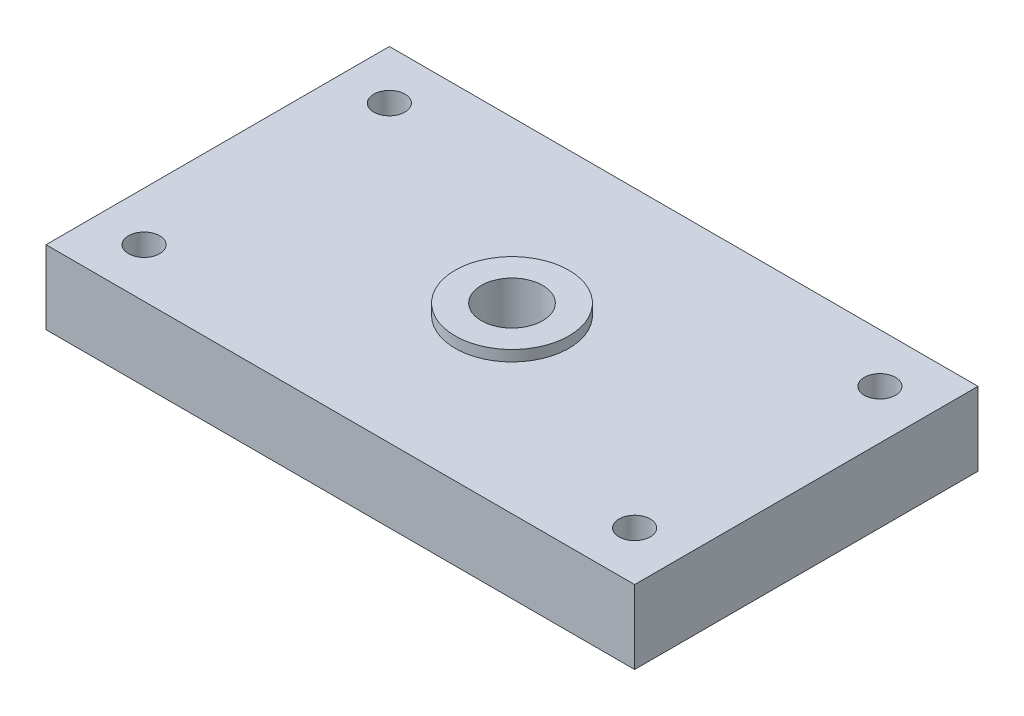
ISO-10303-21;
HEADER;
FILE_DESCRIPTION(('STEP AP214'),'2;1');
FILE_NAME('part.step','',(''),(''),'','','');
FILE_SCHEMA(('AUTOMOTIVE_DESIGN { 1 0 10303 214 1 1 1 1 }'));
ENDSEC;
DATA;
#1=APPLICATION_CONTEXT('core data for automotive mechanical design processes');
#2=APPLICATION_PROTOCOL_DEFINITION('international standard','automotive_design',2000,#1);
#3=PRODUCT_CONTEXT('',#1,'mechanical');
#4=PRODUCT('Part','Part','',(#3));
#5=PRODUCT_RELATED_PRODUCT_CATEGORY('part','',(#4));
#6=PRODUCT_DEFINITION_FORMATION('','',#4);
#7=PRODUCT_DEFINITION_CONTEXT('part definition',#1,'design');
#8=PRODUCT_DEFINITION('design','',#6,#7);
#9=PRODUCT_DEFINITION_SHAPE('','',#8);
#10=(LENGTH_UNIT() NAMED_UNIT(*) SI_UNIT(.MILLI.,.METRE.));
#11=(NAMED_UNIT(*) PLANE_ANGLE_UNIT() SI_UNIT($,.RADIAN.));
#12=(NAMED_UNIT(*) SI_UNIT($,.STERADIAN.) SOLID_ANGLE_UNIT());
#13=UNCERTAINTY_MEASURE_WITH_UNIT(LENGTH_MEASURE(1.E-05),#10,'distance_accuracy_value','');
#14=(GEOMETRIC_REPRESENTATION_CONTEXT(3) GLOBAL_UNCERTAINTY_ASSIGNED_CONTEXT((#13)) GLOBAL_UNIT_ASSIGNED_CONTEXT((#10,
#11,#12)) REPRESENTATION_CONTEXT('',''));
#15=CARTESIAN_POINT('',(0.,0.,0.));
#16=DIRECTION('',(0.,0.,1.));
#17=DIRECTION('',(1.,0.,0.));
#18=AXIS2_PLACEMENT_3D('',#15,#16,#17);
#19=CARTESIAN_POINT('',(0.,9.525,-44.45));
#20=DIRECTION('',(0.,-1.,0.));
#21=DIRECTION('',(0.,0.,-1.));
#22=AXIS2_PLACEMENT_3D('',#19,#20,#21);
#23=PLANE('',#22);
#24=DIRECTION('',(0.,0.,1.));
#25=VECTOR('',#24,1.);
#26=CARTESIAN_POINT('',(0.,9.525,0.));
#27=LINE('',#26,#25);
#28=CARTESIAN_POINT('',(0.,9.525,-44.45));
#29=VERTEX_POINT('',#28);
#30=CARTESIAN_POINT('',(0.,9.525,0.));
#31=VERTEX_POINT('',#30);
#32=EDGE_CURVE('E92',#29,#31,#27,.T.);
#33=ORIENTED_EDGE('',*,*,#32,.T.);
#34=DIRECTION('',(1.,0.,0.));
#35=VECTOR('',#34,1.);
#36=CARTESIAN_POINT('',(0.,9.525,0.));
#37=LINE('',#36,#35);
#38=CARTESIAN_POINT('',(76.2,9.525,0.));
#39=VERTEX_POINT('',#38);
#40=EDGE_CURVE('E87',#31,#39,#37,.T.);
#41=ORIENTED_EDGE('',*,*,#40,.T.);
#42=DIRECTION('',(0.,0.,-1.));
#43=VECTOR('',#42,1.);
#44=CARTESIAN_POINT('',(76.2,9.525,0.));
#45=LINE('',#44,#43);
#46=CARTESIAN_POINT('',(76.2,9.525,-44.45));
#47=VERTEX_POINT('',#46);
#48=EDGE_CURVE('E90',#39,#47,#45,.T.);
#49=ORIENTED_EDGE('',*,*,#48,.T.);
#50=DIRECTION('',(-1.,0.,0.));
#51=VECTOR('',#50,1.);
#52=CARTESIAN_POINT('',(0.,9.525,-44.45));
#53=LINE('',#52,#51);
#54=EDGE_CURVE('E56',#47,#29,#53,.T.);
#55=ORIENTED_EDGE('',*,*,#54,.T.);
#56=EDGE_LOOP('',(#33,#41,#49,#55));
#57=FACE_BOUND('',#56,.T.);
#58=CARTESIAN_POINT('',(6.35,9.525,-6.34999999999999));
#59=DIRECTION('',(0.,1.,0.));
#60=DIRECTION('',(0.,0.,1.));
#61=AXIS2_PLACEMENT_3D('',#58,#59,#60);
#62=CIRCLE('',#61,2.01929999999999);
#63=CARTESIAN_POINT('',(6.35,9.525,-4.3307));
#64=VERTEX_POINT('',#63);
#65=EDGE_CURVE('E193',#64,#64,#62,.T.);
#66=ORIENTED_EDGE('',*,*,#65,.F.);
#67=EDGE_LOOP('',(#66));
#68=FACE_BOUND('',#67,.T.);
#69=CARTESIAN_POINT('',(69.85,9.525,-6.34999999999999));
#70=DIRECTION('',(0.,1.,0.));
#71=DIRECTION('',(0.,0.,1.));
#72=AXIS2_PLACEMENT_3D('',#69,#70,#71);
#73=CIRCLE('',#72,2.01929999999999);
#74=CARTESIAN_POINT('',(69.85,9.525,-4.3307));
#75=VERTEX_POINT('',#74);
#76=EDGE_CURVE('E187',#75,#75,#73,.T.);
#77=ORIENTED_EDGE('',*,*,#76,.F.);
#78=EDGE_LOOP('',(#77));
#79=FACE_BOUND('',#78,.T.);
#80=CARTESIAN_POINT('',(69.85,9.525,-38.1));
#81=DIRECTION('',(0.,1.,0.));
#82=DIRECTION('',(0.,0.,1.));
#83=AXIS2_PLACEMENT_3D('',#80,#81,#82);
#84=CIRCLE('',#83,2.01929999999999);
#85=CARTESIAN_POINT('',(69.85,9.525,-36.0807));
#86=VERTEX_POINT('',#85);
#87=EDGE_CURVE('E181',#86,#86,#84,.T.);
#88=ORIENTED_EDGE('',*,*,#87,.F.);
#89=EDGE_LOOP('',(#88));
#90=FACE_BOUND('',#89,.T.);
#91=CARTESIAN_POINT('',(6.35,9.525,-38.1));
#92=DIRECTION('',(0.,1.,0.));
#93=DIRECTION('',(0.,0.,1.));
#94=AXIS2_PLACEMENT_3D('',#91,#92,#93);
#95=CIRCLE('',#94,2.01929999999999);
#96=CARTESIAN_POINT('',(6.35,9.525,-36.0807));
#97=VERTEX_POINT('',#96);
#98=EDGE_CURVE('E172',#97,#97,#95,.T.);
#99=ORIENTED_EDGE('',*,*,#98,.F.);
#100=EDGE_LOOP('',(#99));
#101=FACE_BOUND('',#100,.T.);
#102=CARTESIAN_POINT('',(38.1,9.525,-22.225));
#103=DIRECTION('',(0.,-1.,0.));
#104=DIRECTION('',(0.,0.,-1.));
#105=AXIS2_PLACEMENT_3D('',#102,#103,#104);
#106=CIRCLE('',#105,7.366);
#107=CARTESIAN_POINT('',(38.1,9.525,-29.591));
#108=VERTEX_POINT('',#107);
#109=EDGE_CURVE('E11',#108,#108,#106,.F.);
#110=ORIENTED_EDGE('',*,*,#109,.F.);
#111=EDGE_LOOP('',(#110));
#112=FACE_BOUND('',#111,.T.);
#113=ADVANCED_FACE('F39',(#57,#68,#79,#90,#101,#112),#23,.F.);
#114=CARTESIAN_POINT('',(0.,9.525,0.));
#115=DIRECTION('',(1.,0.,0.));
#116=DIRECTION('',(0.,0.,-1.));
#117=AXIS2_PLACEMENT_3D('',#114,#115,#116);
#118=PLANE('',#117);
#119=DIRECTION('',(0.,0.,1.));
#120=VECTOR('',#119,1.);
#121=CARTESIAN_POINT('',(0.,0.,0.));
#122=LINE('',#121,#120);
#123=CARTESIAN_POINT('',(0.,0.,-44.45));
#124=VERTEX_POINT('',#123);
#125=CARTESIAN_POINT('',(0.,0.,0.));
#126=VERTEX_POINT('',#125);
#127=EDGE_CURVE('E106',#124,#126,#122,.T.);
#128=ORIENTED_EDGE('',*,*,#127,.T.);
#129=DIRECTION('',(0.,-1.,0.));
#130=VECTOR('',#129,1.);
#131=CARTESIAN_POINT('',(0.,9.525,0.));
#132=LINE('',#131,#130);
#133=EDGE_CURVE('E48',#31,#126,#132,.T.);
#134=ORIENTED_EDGE('',*,*,#133,.F.);
#135=ORIENTED_EDGE('',*,*,#32,.F.);
#136=DIRECTION('',(0.,-1.,0.));
#137=VECTOR('',#136,1.);
#138=CARTESIAN_POINT('',(0.,9.525,-44.45));
#139=LINE('',#138,#137);
#140=EDGE_CURVE('E102',#29,#124,#139,.T.);
#141=ORIENTED_EDGE('',*,*,#140,.T.);
#142=EDGE_LOOP('',(#128,#134,#135,#141));
#143=FACE_BOUND('',#142,.T.);
#144=ADVANCED_FACE('F41',(#143),#118,.F.);
#145=CARTESIAN_POINT('',(0.,9.525,0.));
#146=DIRECTION('',(0.,0.,-1.));
#147=DIRECTION('',(-1.,0.,0.));
#148=AXIS2_PLACEMENT_3D('',#145,#146,#147);
#149=PLANE('',#148);
#150=DIRECTION('',(1.,0.,0.));
#151=VECTOR('',#150,1.);
#152=CARTESIAN_POINT('',(0.,0.,0.));
#153=LINE('',#152,#151);
#154=CARTESIAN_POINT('',(76.2,0.,0.));
#155=VERTEX_POINT('',#154);
#156=EDGE_CURVE('E97',#126,#155,#153,.T.);
#157=ORIENTED_EDGE('',*,*,#156,.T.);
#158=DIRECTION('',(0.,-1.,0.));
#159=VECTOR('',#158,1.);
#160=CARTESIAN_POINT('',(76.2,9.525,0.));
#161=LINE('',#160,#159);
#162=EDGE_CURVE('E95',#39,#155,#161,.T.);
#163=ORIENTED_EDGE('',*,*,#162,.F.);
#164=ORIENTED_EDGE('',*,*,#40,.F.);
#165=ORIENTED_EDGE('',*,*,#133,.T.);
#166=EDGE_LOOP('',(#157,#163,#164,#165));
#167=FACE_BOUND('',#166,.T.);
#168=ADVANCED_FACE('F96',(#167),#149,.F.);
#169=CARTESIAN_POINT('',(76.2,9.525,0.));
#170=DIRECTION('',(-1.,0.,0.));
#171=DIRECTION('',(0.,0.,1.));
#172=AXIS2_PLACEMENT_3D('',#169,#170,#171);
#173=PLANE('',#172);
#174=DIRECTION('',(0.,0.,-1.));
#175=VECTOR('',#174,1.);
#176=CARTESIAN_POINT('',(76.2,0.,0.));
#177=LINE('',#176,#175);
#178=CARTESIAN_POINT('',(76.2,0.,-44.45));
#179=VERTEX_POINT('',#178);
#180=EDGE_CURVE('E73',#155,#179,#177,.T.);
#181=ORIENTED_EDGE('',*,*,#180,.T.);
#182=DIRECTION('',(0.,-1.,0.));
#183=VECTOR('',#182,1.);
#184=CARTESIAN_POINT('',(76.2,9.525,-44.45));
#185=LINE('',#184,#183);
#186=EDGE_CURVE('E98',#47,#179,#185,.T.);
#187=ORIENTED_EDGE('',*,*,#186,.F.);
#188=ORIENTED_EDGE('',*,*,#48,.F.);
#189=ORIENTED_EDGE('',*,*,#162,.T.);
#190=EDGE_LOOP('',(#181,#187,#188,#189));
#191=FACE_BOUND('',#190,.T.);
#192=ADVANCED_FACE('F100',(#191),#173,.F.);
#193=CARTESIAN_POINT('',(0.,9.525,-44.45));
#194=DIRECTION('',(0.,0.,1.));
#195=DIRECTION('',(1.,0.,0.));
#196=AXIS2_PLACEMENT_3D('',#193,#194,#195);
#197=PLANE('',#196);
#198=DIRECTION('',(-1.,0.,0.));
#199=VECTOR('',#198,1.);
#200=CARTESIAN_POINT('',(0.,0.,-44.45));
#201=LINE('',#200,#199);
#202=EDGE_CURVE('E79',#179,#124,#201,.T.);
#203=ORIENTED_EDGE('',*,*,#202,.T.);
#204=ORIENTED_EDGE('',*,*,#140,.F.);
#205=ORIENTED_EDGE('',*,*,#54,.F.);
#206=ORIENTED_EDGE('',*,*,#186,.T.);
#207=EDGE_LOOP('',(#203,#204,#205,#206));
#208=FACE_BOUND('',#207,.T.);
#209=ADVANCED_FACE('F120',(#208),#197,.F.);
#210=CARTESIAN_POINT('',(0.,0.,-44.45));
#211=DIRECTION('',(0.,-1.,0.));
#212=DIRECTION('',(0.,0.,-1.));
#213=AXIS2_PLACEMENT_3D('',#210,#211,#212);
#214=PLANE('',#213);
#215=CARTESIAN_POINT('',(38.1,0.,-22.225));
#216=DIRECTION('',(0.,-1.,0.));
#217=DIRECTION('',(0.,0.,-1.));
#218=AXIS2_PLACEMENT_3D('',#215,#216,#217);
#219=CIRCLE('',#218,3.96874999999999);
#220=CARTESIAN_POINT('',(38.1,0.,-26.19375));
#221=VERTEX_POINT('',#220);
#222=EDGE_CURVE('E168',#221,#221,#219,.T.);
#223=ORIENTED_EDGE('',*,*,#222,.F.);
#224=EDGE_LOOP('',(#223));
#225=FACE_BOUND('',#224,.T.);
#226=CARTESIAN_POINT('',(6.35,0.,-38.1));
#227=DIRECTION('',(0.,1.,0.));
#228=DIRECTION('',(0.,0.,1.));
#229=AXIS2_PLACEMENT_3D('',#226,#227,#228);
#230=CIRCLE('',#229,2.0193);
#231=CARTESIAN_POINT('',(6.35,0.,-36.0807));
#232=VERTEX_POINT('',#231);
#233=EDGE_CURVE('E178',#232,#232,#230,.T.);
#234=ORIENTED_EDGE('',*,*,#233,.T.);
#235=EDGE_LOOP('',(#234));
#236=FACE_BOUND('',#235,.T.);
#237=CARTESIAN_POINT('',(69.85,0.,-38.1));
#238=DIRECTION('',(0.,1.,0.));
#239=DIRECTION('',(0.,0.,1.));
#240=AXIS2_PLACEMENT_3D('',#237,#238,#239);
#241=CIRCLE('',#240,2.0193);
#242=CARTESIAN_POINT('',(69.85,0.,-36.0807));
#243=VERTEX_POINT('',#242);
#244=EDGE_CURVE('E184',#243,#243,#241,.T.);
#245=ORIENTED_EDGE('',*,*,#244,.T.);
#246=EDGE_LOOP('',(#245));
#247=FACE_BOUND('',#246,.T.);
#248=CARTESIAN_POINT('',(69.85,0.,-6.34999999999999));
#249=DIRECTION('',(0.,1.,0.));
#250=DIRECTION('',(0.,0.,1.));
#251=AXIS2_PLACEMENT_3D('',#248,#249,#250);
#252=CIRCLE('',#251,2.0193);
#253=CARTESIAN_POINT('',(69.85,0.,-4.33069999999999));
#254=VERTEX_POINT('',#253);
#255=EDGE_CURVE('E190',#254,#254,#252,.T.);
#256=ORIENTED_EDGE('',*,*,#255,.T.);
#257=EDGE_LOOP('',(#256));
#258=FACE_BOUND('',#257,.T.);
#259=CARTESIAN_POINT('',(6.35,0.,-6.34999999999999));
#260=DIRECTION('',(0.,1.,0.));
#261=DIRECTION('',(0.,0.,1.));
#262=AXIS2_PLACEMENT_3D('',#259,#260,#261);
#263=CIRCLE('',#262,2.0193);
#264=CARTESIAN_POINT('',(6.35,0.,-4.33069999999999));
#265=VERTEX_POINT('',#264);
#266=EDGE_CURVE('E109',#265,#265,#263,.T.);
#267=ORIENTED_EDGE('',*,*,#266,.T.);
#268=EDGE_LOOP('',(#267));
#269=FACE_BOUND('',#268,.T.);
#270=ORIENTED_EDGE('',*,*,#127,.F.);
#271=ORIENTED_EDGE('',*,*,#202,.F.);
#272=ORIENTED_EDGE('',*,*,#180,.F.);
#273=ORIENTED_EDGE('',*,*,#156,.F.);
#274=EDGE_LOOP('',(#270,#271,#272,#273));
#275=FACE_BOUND('',#274,.T.);
#276=ADVANCED_FACE('F117',(#225,#236,#247,#258,#269,#275),#214,.T.);
#277=CARTESIAN_POINT('',(6.35,9.525,-6.34999999999999));
#278=DIRECTION('',(0.,1.,0.));
#279=DIRECTION('',(0.,0.,1.));
#280=AXIS2_PLACEMENT_3D('',#277,#278,#279);
#281=CYLINDRICAL_SURFACE('',#280,2.01929999999999);
#282=ORIENTED_EDGE('',*,*,#266,.F.);
#283=EDGE_LOOP('',(#282));
#284=FACE_BOUND('',#283,.T.);
#285=ORIENTED_EDGE('',*,*,#65,.T.);
#286=EDGE_LOOP('',(#285));
#287=FACE_BOUND('',#286,.T.);
#288=ADVANCED_FACE('F119',(#284,#287),#281,.F.);
#289=CARTESIAN_POINT('',(69.85,9.525,-6.34999999999999));
#290=DIRECTION('',(0.,1.,0.));
#291=DIRECTION('',(0.,0.,1.));
#292=AXIS2_PLACEMENT_3D('',#289,#290,#291);
#293=CYLINDRICAL_SURFACE('',#292,2.01929999999999);
#294=ORIENTED_EDGE('',*,*,#255,.F.);
#295=EDGE_LOOP('',(#294));
#296=FACE_BOUND('',#295,.T.);
#297=ORIENTED_EDGE('',*,*,#76,.T.);
#298=EDGE_LOOP('',(#297));
#299=FACE_BOUND('',#298,.T.);
#300=ADVANCED_FACE('F127',(#296,#299),#293,.F.);
#301=CARTESIAN_POINT('',(69.85,9.525,-38.1));
#302=DIRECTION('',(0.,1.,0.));
#303=DIRECTION('',(0.,0.,1.));
#304=AXIS2_PLACEMENT_3D('',#301,#302,#303);
#305=CYLINDRICAL_SURFACE('',#304,2.01929999999999);
#306=ORIENTED_EDGE('',*,*,#244,.F.);
#307=EDGE_LOOP('',(#306));
#308=FACE_BOUND('',#307,.T.);
#309=ORIENTED_EDGE('',*,*,#87,.T.);
#310=EDGE_LOOP('',(#309));
#311=FACE_BOUND('',#310,.T.);
#312=ADVANCED_FACE('F141',(#308,#311),#305,.F.);
#313=CARTESIAN_POINT('',(6.35,9.525,-38.1));
#314=DIRECTION('',(0.,1.,0.));
#315=DIRECTION('',(0.,0.,1.));
#316=AXIS2_PLACEMENT_3D('',#313,#314,#315);
#317=CYLINDRICAL_SURFACE('',#316,2.01929999999999);
#318=ORIENTED_EDGE('',*,*,#233,.F.);
#319=EDGE_LOOP('',(#318));
#320=FACE_BOUND('',#319,.T.);
#321=ORIENTED_EDGE('',*,*,#98,.T.);
#322=EDGE_LOOP('',(#321));
#323=FACE_BOUND('',#322,.T.);
#324=ADVANCED_FACE('F145',(#320,#323),#317,.F.);
#325=CARTESIAN_POINT('',(38.1,10.922,-22.225));
#326=DIRECTION('',(0.,-1.,0.));
#327=DIRECTION('',(0.,0.,-1.));
#328=AXIS2_PLACEMENT_3D('',#325,#326,#327);
#329=CYLINDRICAL_SURFACE('',#328,7.366);
#330=CARTESIAN_POINT('',(38.1,10.922,-22.225));
#331=DIRECTION('',(0.,1.,0.));
#332=DIRECTION('',(0.,0.,1.));
#333=AXIS2_PLACEMENT_3D('',#330,#331,#332);
#334=CIRCLE('',#333,7.366);
#335=CARTESIAN_POINT('',(38.1,10.922,-14.859));
#336=VERTEX_POINT('',#335);
#337=EDGE_CURVE('E169',#336,#336,#334,.T.);
#338=ORIENTED_EDGE('',*,*,#337,.F.);
#339=EDGE_LOOP('',(#338));
#340=FACE_BOUND('',#339,.T.);
#341=ORIENTED_EDGE('',*,*,#109,.T.);
#342=EDGE_LOOP('',(#341));
#343=FACE_BOUND('',#342,.T.);
#344=ADVANCED_FACE('F149',(#340,#343),#329,.T.);
#345=CARTESIAN_POINT('',(38.1,10.922,-22.225));
#346=DIRECTION('',(0.,1.,0.));
#347=DIRECTION('',(0.,0.,1.));
#348=AXIS2_PLACEMENT_3D('',#345,#346,#347);
#349=PLANE('',#348);
#350=CARTESIAN_POINT('',(38.1,10.922,-22.225));
#351=DIRECTION('',(0.,1.,0.));
#352=DIRECTION('',(0.,0.,1.));
#353=AXIS2_PLACEMENT_3D('',#350,#351,#352);
#354=CIRCLE('',#353,3.96874999999999);
#355=CARTESIAN_POINT('',(38.1,10.922,-18.25625));
#356=VERTEX_POINT('',#355);
#357=EDGE_CURVE('E166',#356,#356,#354,.T.);
#358=ORIENTED_EDGE('',*,*,#357,.F.);
#359=EDGE_LOOP('',(#358));
#360=FACE_BOUND('',#359,.T.);
#361=ORIENTED_EDGE('',*,*,#337,.T.);
#362=EDGE_LOOP('',(#361));
#363=FACE_BOUND('',#362,.T.);
#364=ADVANCED_FACE('F153',(#360,#363),#349,.T.);
#365=CARTESIAN_POINT('',(38.1,10.922,-22.225));
#366=DIRECTION('',(0.,1.,0.));
#367=DIRECTION('',(0.,0.,1.));
#368=AXIS2_PLACEMENT_3D('',#365,#366,#367);
#369=CYLINDRICAL_SURFACE('',#368,3.96874999999999);
#370=ORIENTED_EDGE('',*,*,#357,.T.);
#371=EDGE_LOOP('',(#370));
#372=FACE_BOUND('',#371,.T.);
#373=ORIENTED_EDGE('',*,*,#222,.T.);
#374=EDGE_LOOP('',(#373));
#375=FACE_BOUND('',#374,.T.);
#376=ADVANCED_FACE('F157',(#372,#375),#369,.F.);
#377=CLOSED_SHELL('',(#113,#144,#168,#192,#209,#276,#288,#300,#312,#324,#344,#364,#376));
#378=MANIFOLD_SOLID_BREP('B2',#377);
#379=ADVANCED_BREP_SHAPE_REPRESENTATION('',(#18,#378),#14);
#380=SHAPE_DEFINITION_REPRESENTATION(#9,#379);
ENDSEC;
END-ISO-10303-21;
